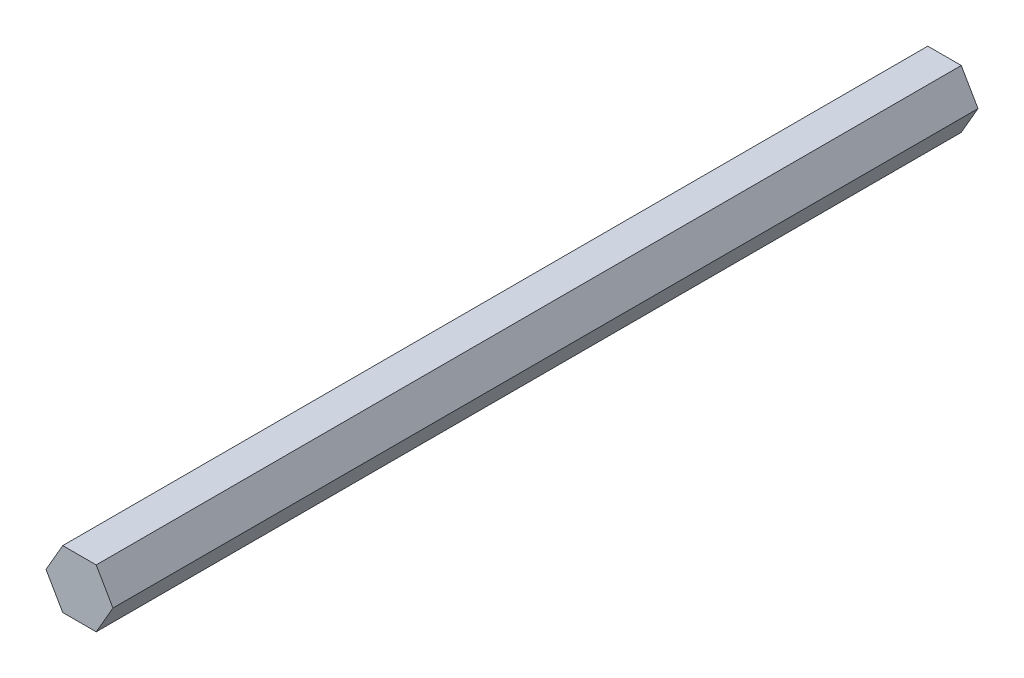
ISO-10303-21;
HEADER;
FILE_DESCRIPTION(('STEP AP214'),'2;1');
FILE_NAME('part.step','',(''),(''),'','','');
FILE_SCHEMA(('AUTOMOTIVE_DESIGN { 1 0 10303 214 1 1 1 1 }'));
ENDSEC;
DATA;
#1=APPLICATION_CONTEXT('core data for automotive mechanical design processes');
#2=APPLICATION_PROTOCOL_DEFINITION('international standard','automotive_design',2000,#1);
#3=PRODUCT_CONTEXT('',#1,'mechanical');
#4=PRODUCT('Part','Part','',(#3));
#5=PRODUCT_RELATED_PRODUCT_CATEGORY('part','',(#4));
#6=PRODUCT_DEFINITION_FORMATION('','',#4);
#7=PRODUCT_DEFINITION_CONTEXT('part definition',#1,'design');
#8=PRODUCT_DEFINITION('design','',#6,#7);
#9=PRODUCT_DEFINITION_SHAPE('','',#8);
#10=(LENGTH_UNIT() NAMED_UNIT(*) SI_UNIT(.MILLI.,.METRE.));
#11=(NAMED_UNIT(*) PLANE_ANGLE_UNIT() SI_UNIT($,.RADIAN.));
#12=(NAMED_UNIT(*) SI_UNIT($,.STERADIAN.) SOLID_ANGLE_UNIT());
#13=UNCERTAINTY_MEASURE_WITH_UNIT(LENGTH_MEASURE(1.E-05),#10,'distance_accuracy_value','');
#14=(GEOMETRIC_REPRESENTATION_CONTEXT(3) GLOBAL_UNCERTAINTY_ASSIGNED_CONTEXT((#13)) GLOBAL_UNIT_ASSIGNED_CONTEXT((#10,
#11,#12)) REPRESENTATION_CONTEXT('',''));
#15=CARTESIAN_POINT('',(0.,0.,0.));
#16=DIRECTION('',(0.,0.,1.));
#17=DIRECTION('',(1.,0.,0.));
#18=AXIS2_PLACEMENT_3D('',#15,#16,#17);
#19=CARTESIAN_POINT('',(3.6661742093542,-6.34999999999996,189.5));
#20=DIRECTION('',(-0.866025403784441,0.499999999999995,0.));
#21=DIRECTION('',(-0.499999999999995,-0.866025403784441,0.));
#22=AXIS2_PLACEMENT_3D('',#19,#20,#21);
#23=PLANE('',#22);
#24=DIRECTION('',(0.499999999999995,0.866025403784441,0.));
#25=VECTOR('',#24,1.);
#26=CARTESIAN_POINT('',(3.6661742093542,-6.34999999999996,0.));
#27=LINE('',#26,#25);
#28=CARTESIAN_POINT('',(3.6661742093542,-6.34999999999996,0.));
#29=VERTEX_POINT('',#28);
#30=CARTESIAN_POINT('',(7.33234841870825,0.,0.));
#31=VERTEX_POINT('',#30);
#32=EDGE_CURVE('E125',#29,#31,#27,.T.);
#33=ORIENTED_EDGE('',*,*,#32,.T.);
#34=DIRECTION('',(0.,0.,-1.));
#35=VECTOR('',#34,1.);
#36=CARTESIAN_POINT('',(7.33234841870825,0.,189.5));
#37=LINE('',#36,#35);
#38=CARTESIAN_POINT('',(7.33234841870825,0.,189.5));
#39=VERTEX_POINT('',#38);
#40=EDGE_CURVE('E11',#39,#31,#37,.T.);
#41=ORIENTED_EDGE('',*,*,#40,.F.);
#42=DIRECTION('',(0.499999999999995,0.866025403784441,0.));
#43=VECTOR('',#42,1.);
#44=CARTESIAN_POINT('',(3.6661742093542,-6.34999999999996,189.5));
#45=LINE('',#44,#43);
#46=CARTESIAN_POINT('',(3.6661742093542,-6.34999999999996,189.5));
#47=VERTEX_POINT('',#46);
#48=EDGE_CURVE('E135',#47,#39,#45,.T.);
#49=ORIENTED_EDGE('',*,*,#48,.F.);
#50=DIRECTION('',(0.,0.,-1.));
#51=VECTOR('',#50,1.);
#52=CARTESIAN_POINT('',(3.6661742093542,-6.34999999999996,189.5));
#53=LINE('',#52,#51);
#54=EDGE_CURVE('E121',#47,#29,#53,.T.);
#55=ORIENTED_EDGE('',*,*,#54,.T.);
#56=EDGE_LOOP('',(#33,#41,#49,#55));
#57=FACE_BOUND('',#56,.T.);
#58=ADVANCED_FACE('F41',(#57),#23,.F.);
#59=CARTESIAN_POINT('',(7.33234841870825,0.,189.5));
#60=DIRECTION('',(-0.866025403784438,-0.500000000000001,0.));
#61=DIRECTION('',(0.500000000000001,-0.866025403784438,0.));
#62=AXIS2_PLACEMENT_3D('',#59,#60,#61);
#63=PLANE('',#62);
#64=DIRECTION('',(-0.500000000000001,0.866025403784438,0.));
#65=VECTOR('',#64,1.);
#66=CARTESIAN_POINT('',(7.33234841870825,0.,0.));
#67=LINE('',#66,#65);
#68=CARTESIAN_POINT('',(3.66617420935411,6.35000000000001,0.));
#69=VERTEX_POINT('',#68);
#70=EDGE_CURVE('E128',#31,#69,#67,.T.);
#71=ORIENTED_EDGE('',*,*,#70,.T.);
#72=DIRECTION('',(0.,0.,-1.));
#73=VECTOR('',#72,1.);
#74=CARTESIAN_POINT('',(3.66617420935411,6.35000000000001,189.5));
#75=LINE('',#74,#73);
#76=CARTESIAN_POINT('',(3.66617420935411,6.35000000000001,189.5));
#77=VERTEX_POINT('',#76);
#78=EDGE_CURVE('E49',#77,#69,#75,.T.);
#79=ORIENTED_EDGE('',*,*,#78,.F.);
#80=DIRECTION('',(-0.500000000000001,0.866025403784438,0.));
#81=VECTOR('',#80,1.);
#82=CARTESIAN_POINT('',(7.33234841870825,0.,189.5));
#83=LINE('',#82,#81);
#84=EDGE_CURVE('E94',#39,#77,#83,.T.);
#85=ORIENTED_EDGE('',*,*,#84,.F.);
#86=ORIENTED_EDGE('',*,*,#40,.T.);
#87=EDGE_LOOP('',(#71,#79,#85,#86));
#88=FACE_BOUND('',#87,.T.);
#89=ADVANCED_FACE('F159',(#88),#63,.F.);
#90=CARTESIAN_POINT('',(3.66617420935411,6.35000000000001,189.5));
#91=DIRECTION('',(0.,-1.,0.));
#92=DIRECTION('',(1.,0.,0.));
#93=AXIS2_PLACEMENT_3D('',#90,#91,#92);
#94=PLANE('',#93);
#95=DIRECTION('',(-1.,0.,0.));
#96=VECTOR('',#95,1.);
#97=CARTESIAN_POINT('',(3.66617420935411,6.35000000000001,0.));
#98=LINE('',#97,#96);
#99=CARTESIAN_POINT('',(-3.66617420935415,6.34999999999999,0.));
#100=VERTEX_POINT('',#99);
#101=EDGE_CURVE('E130',#69,#100,#98,.T.);
#102=ORIENTED_EDGE('',*,*,#101,.T.);
#103=DIRECTION('',(0.,0.,-1.));
#104=VECTOR('',#103,1.);
#105=CARTESIAN_POINT('',(-3.66617420935415,6.34999999999999,189.5));
#106=LINE('',#105,#104);
#107=CARTESIAN_POINT('',(-3.66617420935415,6.34999999999999,189.5));
#108=VERTEX_POINT('',#107);
#109=EDGE_CURVE('E116',#108,#100,#106,.T.);
#110=ORIENTED_EDGE('',*,*,#109,.F.);
#111=DIRECTION('',(-1.,0.,0.));
#112=VECTOR('',#111,1.);
#113=CARTESIAN_POINT('',(3.66617420935411,6.35000000000001,189.5));
#114=LINE('',#113,#112);
#115=EDGE_CURVE('E107',#77,#108,#114,.T.);
#116=ORIENTED_EDGE('',*,*,#115,.F.);
#117=ORIENTED_EDGE('',*,*,#78,.T.);
#118=EDGE_LOOP('',(#102,#110,#116,#117));
#119=FACE_BOUND('',#118,.T.);
#120=ADVANCED_FACE('F141',(#119),#94,.F.);
#121=CARTESIAN_POINT('',(-3.66617420935415,6.34999999999999,189.5));
#122=DIRECTION('',(0.866025403784442,-0.499999999999995,0.));
#123=DIRECTION('',(0.499999999999995,0.866025403784442,0.));
#124=AXIS2_PLACEMENT_3D('',#121,#122,#123);
#125=PLANE('',#124);
#126=DIRECTION('',(-0.499999999999995,-0.866025403784442,0.));
#127=VECTOR('',#126,1.);
#128=CARTESIAN_POINT('',(-3.66617420935415,6.34999999999999,0.));
#129=LINE('',#128,#127);
#130=CARTESIAN_POINT('',(-7.33234841870825,0.,0.));
#131=VERTEX_POINT('',#130);
#132=EDGE_CURVE('E115',#100,#131,#129,.T.);
#133=ORIENTED_EDGE('',*,*,#132,.T.);
#134=DIRECTION('',(0.,0.,-1.));
#135=VECTOR('',#134,1.);
#136=CARTESIAN_POINT('',(-7.33234841870825,0.,189.5));
#137=LINE('',#136,#135);
#138=CARTESIAN_POINT('',(-7.33234841870825,0.,189.5));
#139=VERTEX_POINT('',#138);
#140=EDGE_CURVE('E112',#139,#131,#137,.T.);
#141=ORIENTED_EDGE('',*,*,#140,.F.);
#142=DIRECTION('',(-0.499999999999995,-0.866025403784442,0.));
#143=VECTOR('',#142,1.);
#144=CARTESIAN_POINT('',(-3.66617420935415,6.34999999999999,189.5));
#145=LINE('',#144,#143);
#146=EDGE_CURVE('E101',#108,#139,#145,.T.);
#147=ORIENTED_EDGE('',*,*,#146,.F.);
#148=ORIENTED_EDGE('',*,*,#109,.T.);
#149=EDGE_LOOP('',(#133,#141,#147,#148));
#150=FACE_BOUND('',#149,.T.);
#151=ADVANCED_FACE('F113',(#150),#125,.F.);
#152=CARTESIAN_POINT('',(-7.33234841870825,0.,189.5));
#153=DIRECTION('',(0.866025403784435,0.500000000000007,0.));
#154=DIRECTION('',(-0.500000000000007,0.866025403784435,0.));
#155=AXIS2_PLACEMENT_3D('',#152,#153,#154);
#156=PLANE('',#155);
#157=DIRECTION('',(0.500000000000007,-0.866025403784434,0.));
#158=VECTOR('',#157,1.);
#159=CARTESIAN_POINT('',(-7.33234841870825,0.,0.));
#160=LINE('',#159,#158);
#161=CARTESIAN_POINT('',(-3.66617420935407,-6.35000000000004,0.));
#162=VERTEX_POINT('',#161);
#163=EDGE_CURVE('E80',#131,#162,#160,.T.);
#164=ORIENTED_EDGE('',*,*,#163,.T.);
#165=DIRECTION('',(0.,0.,-1.));
#166=VECTOR('',#165,1.);
#167=CARTESIAN_POINT('',(-3.66617420935407,-6.35000000000004,189.5));
#168=LINE('',#167,#166);
#169=CARTESIAN_POINT('',(-3.66617420935407,-6.35000000000004,189.5));
#170=VERTEX_POINT('',#169);
#171=EDGE_CURVE('E117',#170,#162,#168,.T.);
#172=ORIENTED_EDGE('',*,*,#171,.F.);
#173=DIRECTION('',(0.500000000000007,-0.866025403784434,0.));
#174=VECTOR('',#173,1.);
#175=CARTESIAN_POINT('',(-7.33234841870825,0.,189.5));
#176=LINE('',#175,#174);
#177=EDGE_CURVE('E105',#139,#170,#176,.T.);
#178=ORIENTED_EDGE('',*,*,#177,.F.);
#179=ORIENTED_EDGE('',*,*,#140,.T.);
#180=EDGE_LOOP('',(#164,#172,#178,#179));
#181=FACE_BOUND('',#180,.T.);
#182=ADVANCED_FACE('F119',(#181),#156,.F.);
#183=CARTESIAN_POINT('',(-3.66617420935407,-6.35000000000004,189.5));
#184=DIRECTION('',(0.,1.,0.));
#185=DIRECTION('',(-1.,0.,0.));
#186=AXIS2_PLACEMENT_3D('',#183,#184,#185);
#187=PLANE('',#186);
#188=DIRECTION('',(1.,0.,0.));
#189=VECTOR('',#188,1.);
#190=CARTESIAN_POINT('',(-3.66617420935407,-6.35000000000004,0.));
#191=LINE('',#190,#189);
#192=EDGE_CURVE('E86',#162,#29,#191,.T.);
#193=ORIENTED_EDGE('',*,*,#192,.T.);
#194=ORIENTED_EDGE('',*,*,#54,.F.);
#195=DIRECTION('',(1.,0.,0.));
#196=VECTOR('',#195,1.);
#197=CARTESIAN_POINT('',(-3.66617420935407,-6.35000000000004,189.5));
#198=LINE('',#197,#196);
#199=EDGE_CURVE('E57',#170,#47,#198,.T.);
#200=ORIENTED_EDGE('',*,*,#199,.F.);
#201=ORIENTED_EDGE('',*,*,#171,.T.);
#202=EDGE_LOOP('',(#193,#194,#200,#201));
#203=FACE_BOUND('',#202,.T.);
#204=ADVANCED_FACE('F148',(#203),#187,.F.);
#205=CARTESIAN_POINT('',(0.,0.,189.5));
#206=DIRECTION('',(0.,0.,1.));
#207=DIRECTION('',(1.,0.,0.));
#208=AXIS2_PLACEMENT_3D('',#205,#206,#207);
#209=PLANE('',#208);
#210=ORIENTED_EDGE('',*,*,#48,.T.);
#211=ORIENTED_EDGE('',*,*,#84,.T.);
#212=ORIENTED_EDGE('',*,*,#115,.T.);
#213=ORIENTED_EDGE('',*,*,#146,.T.);
#214=ORIENTED_EDGE('',*,*,#177,.T.);
#215=ORIENTED_EDGE('',*,*,#199,.T.);
#216=EDGE_LOOP('',(#210,#211,#212,#213,#214,#215));
#217=FACE_BOUND('',#216,.T.);
#218=ADVANCED_FACE('F103',(#217),#209,.T.);
#219=CARTESIAN_POINT('',(0.,0.,0.));
#220=DIRECTION('',(0.,0.,1.));
#221=DIRECTION('',(1.,0.,0.));
#222=AXIS2_PLACEMENT_3D('',#219,#220,#221);
#223=PLANE('',#222);
#224=ORIENTED_EDGE('',*,*,#32,.F.);
#225=ORIENTED_EDGE('',*,*,#192,.F.);
#226=ORIENTED_EDGE('',*,*,#163,.F.);
#227=ORIENTED_EDGE('',*,*,#132,.F.);
#228=ORIENTED_EDGE('',*,*,#101,.F.);
#229=ORIENTED_EDGE('',*,*,#70,.F.);
#230=EDGE_LOOP('',(#224,#225,#226,#227,#228,#229));
#231=FACE_BOUND('',#230,.T.);
#232=ADVANCED_FACE('F144',(#231),#223,.F.);
#233=CLOSED_SHELL('',(#58,#89,#120,#151,#182,#204,#218,#232));
#234=MANIFOLD_SOLID_BREP('B2',#233);
#235=ADVANCED_BREP_SHAPE_REPRESENTATION('',(#18,#234),#14);
#236=SHAPE_DEFINITION_REPRESENTATION(#9,#235);
ENDSEC;
END-ISO-10303-21;
